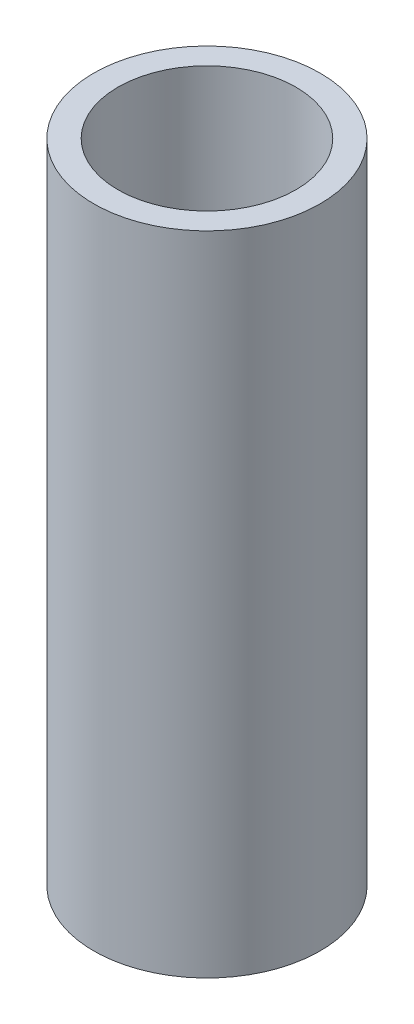
ISO-10303-21;
HEADER;
FILE_DESCRIPTION(('STEP AP214'),'2;1');
FILE_NAME('part.step','',(''),(''),'','','');
FILE_SCHEMA(('AUTOMOTIVE_DESIGN { 1 0 10303 214 1 1 1 1 }'));
ENDSEC;
DATA;
#1=APPLICATION_CONTEXT('core data for automotive mechanical design processes');
#2=APPLICATION_PROTOCOL_DEFINITION('international standard','automotive_design',2000,#1);
#3=PRODUCT_CONTEXT('',#1,'mechanical');
#4=PRODUCT('Part','Part','',(#3));
#5=PRODUCT_RELATED_PRODUCT_CATEGORY('part','',(#4));
#6=PRODUCT_DEFINITION_FORMATION('','',#4);
#7=PRODUCT_DEFINITION_CONTEXT('part definition',#1,'design');
#8=PRODUCT_DEFINITION('design','',#6,#7);
#9=PRODUCT_DEFINITION_SHAPE('','',#8);
#10=(LENGTH_UNIT() NAMED_UNIT(*) SI_UNIT(.MILLI.,.METRE.));
#11=(NAMED_UNIT(*) PLANE_ANGLE_UNIT() SI_UNIT($,.RADIAN.));
#12=(NAMED_UNIT(*) SI_UNIT($,.STERADIAN.) SOLID_ANGLE_UNIT());
#13=UNCERTAINTY_MEASURE_WITH_UNIT(LENGTH_MEASURE(1.E-05),#10,'distance_accuracy_value','');
#14=(GEOMETRIC_REPRESENTATION_CONTEXT(3) GLOBAL_UNCERTAINTY_ASSIGNED_CONTEXT((#13)) GLOBAL_UNIT_ASSIGNED_CONTEXT((#10,
#11,#12)) REPRESENTATION_CONTEXT('',''));
#15=CARTESIAN_POINT('',(0.,0.,0.));
#16=DIRECTION('',(0.,0.,1.));
#17=DIRECTION('',(1.,0.,0.));
#18=AXIS2_PLACEMENT_3D('',#15,#16,#17);
#19=CARTESIAN_POINT('',(0.,40.,7.));
#20=DIRECTION('',(0.,-1.,0.));
#21=DIRECTION('',(0.,0.,-1.));
#22=AXIS2_PLACEMENT_3D('',#19,#20,#21);
#23=PLANE('',#22);
#24=CARTESIAN_POINT('',(0.,40.,0.));
#25=DIRECTION('',(0.,1.,0.));
#26=DIRECTION('',(0.,0.,1.));
#27=AXIS2_PLACEMENT_3D('',#24,#25,#26);
#28=CIRCLE('',#27,5.5);
#29=CARTESIAN_POINT('',(0.,40.,5.5));
#30=VERTEX_POINT('',#29);
#31=EDGE_CURVE('E47',#30,#30,#28,.T.);
#32=ORIENTED_EDGE('',*,*,#31,.F.);
#33=EDGE_LOOP('',(#32));
#34=FACE_BOUND('',#33,.T.);
#35=CARTESIAN_POINT('',(0.,40.,0.));
#36=DIRECTION('',(0.,-1.,0.));
#37=DIRECTION('',(0.,0.,-1.));
#38=AXIS2_PLACEMENT_3D('',#35,#36,#37);
#39=CIRCLE('',#38,7.);
#40=CARTESIAN_POINT('',(0.,40.,-7.));
#41=VERTEX_POINT('',#40);
#42=EDGE_CURVE('E10',#41,#41,#39,.T.);
#43=ORIENTED_EDGE('',*,*,#42,.F.);
#44=EDGE_LOOP('',(#43));
#45=FACE_BOUND('',#44,.T.);
#46=ADVANCED_FACE('F33',(#34,#45),#23,.F.);
#47=CARTESIAN_POINT('',(0.,0.,0.));
#48=DIRECTION('',(0.,-1.,0.));
#49=DIRECTION('',(0.,0.,-1.));
#50=AXIS2_PLACEMENT_3D('',#47,#48,#49);
#51=CYLINDRICAL_SURFACE('',#50,7.);
#52=CARTESIAN_POINT('',(0.,0.,0.));
#53=DIRECTION('',(0.,-1.,0.));
#54=DIRECTION('',(0.,0.,-1.));
#55=AXIS2_PLACEMENT_3D('',#52,#53,#54);
#56=CIRCLE('',#55,7.);
#57=CARTESIAN_POINT('',(0.,0.,-7.));
#58=VERTEX_POINT('',#57);
#59=EDGE_CURVE('E39',#58,#58,#56,.T.);
#60=ORIENTED_EDGE('',*,*,#59,.F.);
#61=EDGE_LOOP('',(#60));
#62=FACE_BOUND('',#61,.T.);
#63=ORIENTED_EDGE('',*,*,#42,.T.);
#64=EDGE_LOOP('',(#63));
#65=FACE_BOUND('',#64,.T.);
#66=ADVANCED_FACE('F57',(#62,#65),#51,.T.);
#67=CARTESIAN_POINT('',(0.,0.,7.));
#68=DIRECTION('',(0.,1.,0.));
#69=DIRECTION('',(0.,0.,1.));
#70=AXIS2_PLACEMENT_3D('',#67,#68,#69);
#71=PLANE('',#70);
#72=ORIENTED_EDGE('',*,*,#59,.T.);
#73=EDGE_LOOP('',(#72));
#74=FACE_BOUND('',#73,.T.);
#75=ADVANCED_FACE('F61',(#74),#71,.F.);
#76=CARTESIAN_POINT('',(0.,5.,0.));
#77=DIRECTION('',(0.,1.,0.));
#78=DIRECTION('',(0.,0.,1.));
#79=AXIS2_PLACEMENT_3D('',#76,#77,#78);
#80=CYLINDRICAL_SURFACE('',#79,5.5);
#81=CARTESIAN_POINT('',(0.,5.,0.));
#82=DIRECTION('',(0.,1.,0.));
#83=DIRECTION('',(0.,0.,1.));
#84=AXIS2_PLACEMENT_3D('',#81,#82,#83);
#85=CIRCLE('',#84,5.5);
#86=CARTESIAN_POINT('',(0.,5.,5.5));
#87=VERTEX_POINT('',#86);
#88=EDGE_CURVE('E43',#87,#87,#85,.T.);
#89=ORIENTED_EDGE('',*,*,#88,.F.);
#90=EDGE_LOOP('',(#89));
#91=FACE_BOUND('',#90,.T.);
#92=ORIENTED_EDGE('',*,*,#31,.T.);
#93=EDGE_LOOP('',(#92));
#94=FACE_BOUND('',#93,.T.);
#95=ADVANCED_FACE('F53',(#91,#94),#80,.F.);
#96=CARTESIAN_POINT('',(0.,5.,0.));
#97=DIRECTION('',(0.,1.,0.));
#98=DIRECTION('',(0.,0.,1.));
#99=AXIS2_PLACEMENT_3D('',#96,#97,#98);
#100=PLANE('',#99);
#101=ORIENTED_EDGE('',*,*,#88,.T.);
#102=EDGE_LOOP('',(#101));
#103=FACE_BOUND('',#102,.T.);
#104=ADVANCED_FACE('F70',(#103),#100,.T.);
#105=CLOSED_SHELL('',(#46,#66,#75,#95,#104));
#106=MANIFOLD_SOLID_BREP('B2',#105);
#107=ADVANCED_BREP_SHAPE_REPRESENTATION('',(#18,#106),#14);
#108=SHAPE_DEFINITION_REPRESENTATION(#9,#107);
ENDSEC;
END-ISO-10303-21;
